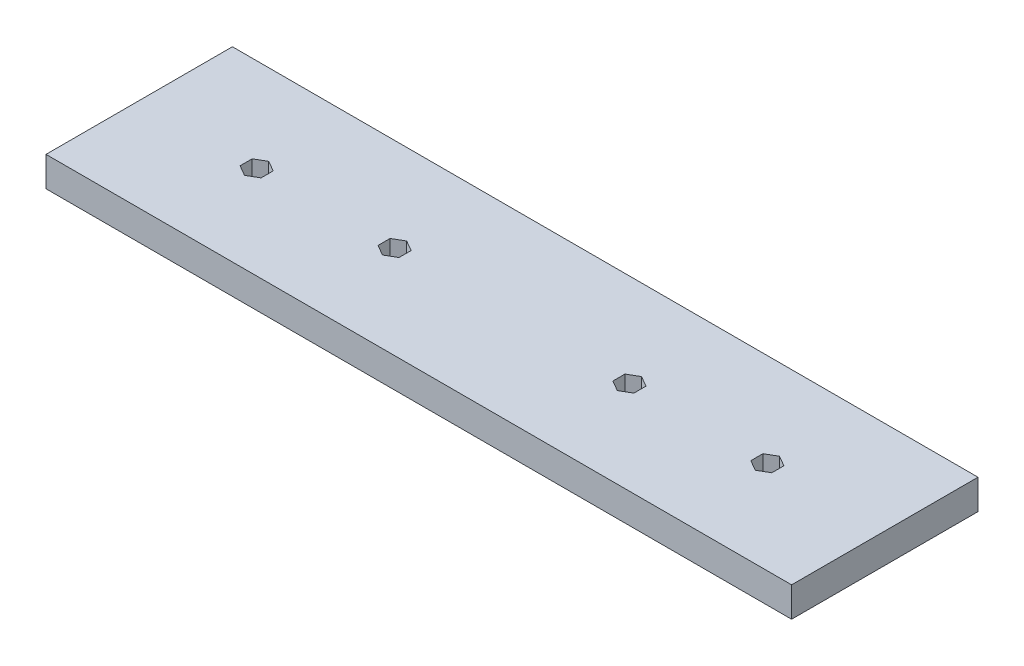
ISO-10303-21;
HEADER;
FILE_DESCRIPTION(('STEP AP214'),'2;1');
FILE_NAME('part.step','',(''),(''),'','','');
FILE_SCHEMA(('AUTOMOTIVE_DESIGN { 1 0 10303 214 1 1 1 1 }'));
ENDSEC;
DATA;
#1=APPLICATION_CONTEXT('core data for automotive mechanical design processes');
#2=APPLICATION_PROTOCOL_DEFINITION('international standard','automotive_design',2000,#1);
#3=PRODUCT_CONTEXT('',#1,'mechanical');
#4=PRODUCT('Part','Part','',(#3));
#5=PRODUCT_RELATED_PRODUCT_CATEGORY('part','',(#4));
#6=PRODUCT_DEFINITION_FORMATION('','',#4);
#7=PRODUCT_DEFINITION_CONTEXT('part definition',#1,'design');
#8=PRODUCT_DEFINITION('design','',#6,#7);
#9=PRODUCT_DEFINITION_SHAPE('','',#8);
#10=(LENGTH_UNIT() NAMED_UNIT(*) SI_UNIT(.MILLI.,.METRE.));
#11=(NAMED_UNIT(*) PLANE_ANGLE_UNIT() SI_UNIT($,.RADIAN.));
#12=(NAMED_UNIT(*) SI_UNIT($,.STERADIAN.) SOLID_ANGLE_UNIT());
#13=UNCERTAINTY_MEASURE_WITH_UNIT(LENGTH_MEASURE(1.E-05),#10,'distance_accuracy_value','');
#14=(GEOMETRIC_REPRESENTATION_CONTEXT(3) GLOBAL_UNCERTAINTY_ASSIGNED_CONTEXT((#13)) GLOBAL_UNIT_ASSIGNED_CONTEXT((#10,
#11,#12)) REPRESENTATION_CONTEXT('',''));
#15=CARTESIAN_POINT('',(0.,0.,0.));
#16=DIRECTION('',(0.,0.,1.));
#17=DIRECTION('',(1.,0.,0.));
#18=AXIS2_PLACEMENT_3D('',#15,#16,#17);
#19=CARTESIAN_POINT('',(375.,-0.00999999999999959,-50.));
#20=DIRECTION('',(-1.,0.,0.));
#21=DIRECTION('',(0.,0.,1.));
#22=AXIS2_PLACEMENT_3D('',#19,#20,#21);
#23=PLANE('',#22);
#24=DIRECTION('',(0.,0.,-1.));
#25=VECTOR('',#24,1.);
#26=CARTESIAN_POINT('',(375.,0.,0.));
#27=LINE('',#26,#25);
#28=CARTESIAN_POINT('',(375.,0.,0.));
#29=VERTEX_POINT('',#28);
#30=CARTESIAN_POINT('',(375.,0.,-50.));
#31=VERTEX_POINT('',#30);
#32=EDGE_CURVE('E213',#29,#31,#27,.T.);
#33=ORIENTED_EDGE('',*,*,#32,.T.);
#34=DIRECTION('',(0.,-1.,0.));
#35=VECTOR('',#34,1.);
#36=CARTESIAN_POINT('',(375.,8.,-50.));
#37=LINE('',#36,#35);
#38=CARTESIAN_POINT('',(375.,8.,-50.));
#39=VERTEX_POINT('',#38);
#40=EDGE_CURVE('E219',#39,#31,#37,.T.);
#41=ORIENTED_EDGE('',*,*,#40,.F.);
#42=DIRECTION('',(0.,0.,-1.));
#43=VECTOR('',#42,1.);
#44=CARTESIAN_POINT('',(375.,8.,0.));
#45=LINE('',#44,#43);
#46=CARTESIAN_POINT('',(375.,8.,0.));
#47=VERTEX_POINT('',#46);
#48=EDGE_CURVE('E223',#47,#39,#45,.T.);
#49=ORIENTED_EDGE('',*,*,#48,.F.);
#50=DIRECTION('',(0.,1.,0.));
#51=VECTOR('',#50,1.);
#52=CARTESIAN_POINT('',(375.,8.,0.));
#53=LINE('',#52,#51);
#54=EDGE_CURVE('E216',#29,#47,#53,.T.);
#55=ORIENTED_EDGE('',*,*,#54,.F.);
#56=EDGE_LOOP('',(#33,#41,#49,#55));
#57=FACE_BOUND('',#56,.T.);
#58=ADVANCED_FACE('F36',(#57),#23,.F.);
#59=CARTESIAN_POINT('',(175.,-0.00999999999999959,-50.));
#60=DIRECTION('',(-1.,0.,0.));
#61=DIRECTION('',(0.,0.,1.));
#62=AXIS2_PLACEMENT_3D('',#59,#60,#61);
#63=PLANE('',#62);
#64=DIRECTION('',(0.,0.,-1.));
#65=VECTOR('',#64,1.);
#66=CARTESIAN_POINT('',(175.,0.,0.));
#67=LINE('',#66,#65);
#68=CARTESIAN_POINT('',(175.,0.,0.));
#69=VERTEX_POINT('',#68);
#70=CARTESIAN_POINT('',(175.,0.,-50.));
#71=VERTEX_POINT('',#70);
#72=EDGE_CURVE('E226',#69,#71,#67,.T.);
#73=ORIENTED_EDGE('',*,*,#72,.F.);
#74=DIRECTION('',(0.,1.,0.));
#75=VECTOR('',#74,1.);
#76=CARTESIAN_POINT('',(175.,8.,0.));
#77=LINE('',#76,#75);
#78=CARTESIAN_POINT('',(175.,8.,0.));
#79=VERTEX_POINT('',#78);
#80=EDGE_CURVE('E220',#69,#79,#77,.T.);
#81=ORIENTED_EDGE('',*,*,#80,.T.);
#82=DIRECTION('',(0.,0.,-1.));
#83=VECTOR('',#82,1.);
#84=CARTESIAN_POINT('',(175.,8.,0.));
#85=LINE('',#84,#83);
#86=CARTESIAN_POINT('',(175.,8.,-50.));
#87=VERTEX_POINT('',#86);
#88=EDGE_CURVE('E40',#79,#87,#85,.T.);
#89=ORIENTED_EDGE('',*,*,#88,.T.);
#90=DIRECTION('',(0.,-1.,0.));
#91=VECTOR('',#90,1.);
#92=CARTESIAN_POINT('',(175.,8.,-50.));
#93=LINE('',#92,#91);
#94=EDGE_CURVE('E241',#87,#71,#93,.T.);
#95=ORIENTED_EDGE('',*,*,#94,.T.);
#96=EDGE_LOOP('',(#73,#81,#89,#95));
#97=FACE_BOUND('',#96,.T.);
#98=ADVANCED_FACE('F250',(#97),#63,.T.);
#99=CARTESIAN_POINT('',(0.,3.,0.));
#100=DIRECTION('',(0.,1.,0.));
#101=DIRECTION('',(0.,0.,1.));
#102=AXIS2_PLACEMENT_3D('',#99,#100,#101);
#103=PLANE('',#102);
#104=DIRECTION('',(0.86602540378444,0.,0.499999999999998));
#105=VECTOR('',#104,1.);
#106=CARTESIAN_POINT('',(203.685417437701,3.,-23.375));
#107=LINE('',#106,#105);
#108=CARTESIAN_POINT('',(203.685417437701,3.,-23.375));
#109=VERTEX_POINT('',#108);
#110=CARTESIAN_POINT('',(206.5,3.,-21.75));
#111=VERTEX_POINT('',#110);
#112=EDGE_CURVE('E188',#109,#111,#107,.T.);
#113=ORIENTED_EDGE('',*,*,#112,.T.);
#114=DIRECTION('',(0.866025403784439,0.,-0.499999999999999));
#115=VECTOR('',#114,1.);
#116=CARTESIAN_POINT('',(206.5,3.,-21.75));
#117=LINE('',#116,#115);
#118=CARTESIAN_POINT('',(209.314582562299,3.,-23.375));
#119=VERTEX_POINT('',#118);
#120=EDGE_CURVE('E197',#111,#119,#117,.T.);
#121=ORIENTED_EDGE('',*,*,#120,.T.);
#122=DIRECTION('',(0.,0.,-1.));
#123=VECTOR('',#122,1.);
#124=CARTESIAN_POINT('',(209.314582562299,3.,-23.375));
#125=LINE('',#124,#123);
#126=CARTESIAN_POINT('',(209.314582562299,3.,-26.625));
#127=VERTEX_POINT('',#126);
#128=EDGE_CURVE('E201',#119,#127,#125,.T.);
#129=ORIENTED_EDGE('',*,*,#128,.T.);
#130=DIRECTION('',(-0.86602540378444,0.,-0.499999999999998));
#131=VECTOR('',#130,1.);
#132=CARTESIAN_POINT('',(209.314582562299,3.,-26.625));
#133=LINE('',#132,#131);
#134=CARTESIAN_POINT('',(206.5,3.,-28.25));
#135=VERTEX_POINT('',#134);
#136=EDGE_CURVE('E456',#127,#135,#133,.T.);
#137=ORIENTED_EDGE('',*,*,#136,.T.);
#138=DIRECTION('',(-0.866025403784439,0.,0.499999999999999));
#139=VECTOR('',#138,1.);
#140=CARTESIAN_POINT('',(206.5,3.,-28.25));
#141=LINE('',#140,#139);
#142=CARTESIAN_POINT('',(203.685417437701,3.,-26.625));
#143=VERTEX_POINT('',#142);
#144=EDGE_CURVE('E454',#135,#143,#141,.T.);
#145=ORIENTED_EDGE('',*,*,#144,.T.);
#146=DIRECTION('',(0.,0.,1.));
#147=VECTOR('',#146,1.);
#148=CARTESIAN_POINT('',(203.685417437701,3.,-26.625));
#149=LINE('',#148,#147);
#150=EDGE_CURVE('E194',#143,#109,#149,.T.);
#151=ORIENTED_EDGE('',*,*,#150,.T.);
#152=EDGE_LOOP('',(#113,#121,#129,#137,#145,#151));
#153=FACE_BOUND('',#152,.T.);
#154=ADVANCED_FACE('F203',(#153),#103,.T.);
#155=CARTESIAN_POINT('',(0.,3.,0.));
#156=DIRECTION('',(0.,1.,0.));
#157=DIRECTION('',(0.,0.,1.));
#158=AXIS2_PLACEMENT_3D('',#155,#156,#157);
#159=PLANE('',#158);
#160=DIRECTION('',(-0.866025403784437,0.,-0.500000000000003));
#161=VECTOR('',#160,1.);
#162=CARTESIAN_POINT('',(246.314582562299,3.,-26.625));
#163=LINE('',#162,#161);
#164=CARTESIAN_POINT('',(246.314582562299,3.,-26.625));
#165=VERTEX_POINT('',#164);
#166=CARTESIAN_POINT('',(243.5,3.,-28.25));
#167=VERTEX_POINT('',#166);
#168=EDGE_CURVE('E405',#165,#167,#163,.T.);
#169=ORIENTED_EDGE('',*,*,#168,.T.);
#170=DIRECTION('',(-0.86602540378444,0.,0.499999999999998));
#171=VECTOR('',#170,1.);
#172=CARTESIAN_POINT('',(243.5,3.,-28.25));
#173=LINE('',#172,#171);
#174=CARTESIAN_POINT('',(240.685417437701,3.,-26.625));
#175=VERTEX_POINT('',#174);
#176=EDGE_CURVE('E429',#167,#175,#173,.T.);
#177=ORIENTED_EDGE('',*,*,#176,.T.);
#178=DIRECTION('',(0.,0.,1.));
#179=VECTOR('',#178,1.);
#180=CARTESIAN_POINT('',(240.685417437701,3.,-26.625));
#181=LINE('',#180,#179);
#182=CARTESIAN_POINT('',(240.685417437701,3.,-23.375));
#183=VERTEX_POINT('',#182);
#184=EDGE_CURVE('E426',#175,#183,#181,.T.);
#185=ORIENTED_EDGE('',*,*,#184,.T.);
#186=DIRECTION('',(0.86602540378444,0.,0.499999999999999));
#187=VECTOR('',#186,1.);
#188=CARTESIAN_POINT('',(240.685417437701,3.,-23.375));
#189=LINE('',#188,#187);
#190=CARTESIAN_POINT('',(243.5,3.,-21.75));
#191=VERTEX_POINT('',#190);
#192=EDGE_CURVE('E423',#183,#191,#189,.T.);
#193=ORIENTED_EDGE('',*,*,#192,.T.);
#194=DIRECTION('',(0.866025403784439,0.,-0.499999999999999));
#195=VECTOR('',#194,1.);
#196=CARTESIAN_POINT('',(243.5,3.,-21.75));
#197=LINE('',#196,#195);
#198=CARTESIAN_POINT('',(246.314582562299,3.,-23.375));
#199=VERTEX_POINT('',#198);
#200=EDGE_CURVE('E420',#191,#199,#197,.T.);
#201=ORIENTED_EDGE('',*,*,#200,.T.);
#202=DIRECTION('',(0.,0.,-1.));
#203=VECTOR('',#202,1.);
#204=CARTESIAN_POINT('',(246.314582562299,3.,-23.375));
#205=LINE('',#204,#203);
#206=EDGE_CURVE('E390',#199,#165,#205,.T.);
#207=ORIENTED_EDGE('',*,*,#206,.T.);
#208=EDGE_LOOP('',(#169,#177,#185,#193,#201,#207));
#209=FACE_BOUND('',#208,.T.);
#210=ADVANCED_FACE('F567',(#209),#159,.T.);
#211=CARTESIAN_POINT('',(0.,3.,0.));
#212=DIRECTION('',(0.,1.,0.));
#213=DIRECTION('',(0.,0.,1.));
#214=AXIS2_PLACEMENT_3D('',#211,#212,#213);
#215=PLANE('',#214);
#216=DIRECTION('',(0.86602540378444,0.,0.499999999999998));
#217=VECTOR('',#216,1.);
#218=CARTESIAN_POINT('',(303.685417437701,3.,-23.375));
#219=LINE('',#218,#217);
#220=CARTESIAN_POINT('',(303.685417437701,3.,-23.375));
#221=VERTEX_POINT('',#220);
#222=CARTESIAN_POINT('',(306.5,3.,-21.75));
#223=VERTEX_POINT('',#222);
#224=EDGE_CURVE('E356',#221,#223,#219,.T.);
#225=ORIENTED_EDGE('',*,*,#224,.T.);
#226=DIRECTION('',(0.866025403784439,0.,-0.499999999999999));
#227=VECTOR('',#226,1.);
#228=CARTESIAN_POINT('',(306.5,3.,-21.75));
#229=LINE('',#228,#227);
#230=CARTESIAN_POINT('',(309.3145825623,3.,-23.375));
#231=VERTEX_POINT('',#230);
#232=EDGE_CURVE('E382',#223,#231,#229,.T.);
#233=ORIENTED_EDGE('',*,*,#232,.T.);
#234=DIRECTION('',(0.,0.,-1.));
#235=VECTOR('',#234,1.);
#236=CARTESIAN_POINT('',(309.3145825623,3.,-23.375));
#237=LINE('',#236,#235);
#238=CARTESIAN_POINT('',(309.3145825623,3.,-26.625));
#239=VERTEX_POINT('',#238);
#240=EDGE_CURVE('E379',#231,#239,#237,.T.);
#241=ORIENTED_EDGE('',*,*,#240,.T.);
#242=DIRECTION('',(-0.86602540378444,0.,-0.499999999999998));
#243=VECTOR('',#242,1.);
#244=CARTESIAN_POINT('',(309.3145825623,3.,-26.625));
#245=LINE('',#244,#243);
#246=CARTESIAN_POINT('',(306.5,3.,-28.25));
#247=VERTEX_POINT('',#246);
#248=EDGE_CURVE('E376',#239,#247,#245,.T.);
#249=ORIENTED_EDGE('',*,*,#248,.T.);
#250=DIRECTION('',(-0.866025403784439,0.,0.499999999999999));
#251=VECTOR('',#250,1.);
#252=CARTESIAN_POINT('',(306.5,3.,-28.25));
#253=LINE('',#252,#251);
#254=CARTESIAN_POINT('',(303.685417437701,3.,-26.625));
#255=VERTEX_POINT('',#254);
#256=EDGE_CURVE('E373',#247,#255,#253,.T.);
#257=ORIENTED_EDGE('',*,*,#256,.T.);
#258=DIRECTION('',(0.,0.,1.));
#259=VECTOR('',#258,1.);
#260=CARTESIAN_POINT('',(303.685417437701,3.,-26.625));
#261=LINE('',#260,#259);
#262=EDGE_CURVE('E340',#255,#221,#261,.T.);
#263=ORIENTED_EDGE('',*,*,#262,.T.);
#264=EDGE_LOOP('',(#225,#233,#241,#249,#257,#263));
#265=FACE_BOUND('',#264,.T.);
#266=ADVANCED_FACE('F544',(#265),#215,.T.);
#267=CARTESIAN_POINT('',(0.,3.,0.));
#268=DIRECTION('',(0.,1.,0.));
#269=DIRECTION('',(0.,0.,1.));
#270=AXIS2_PLACEMENT_3D('',#267,#268,#269);
#271=PLANE('',#270);
#272=DIRECTION('',(-0.866025403784433,0.,-0.50000000000001));
#273=VECTOR('',#272,1.);
#274=CARTESIAN_POINT('',(346.314582562299,3.,-26.625));
#275=LINE('',#274,#273);
#276=CARTESIAN_POINT('',(346.314582562299,3.,-26.625));
#277=VERTEX_POINT('',#276);
#278=CARTESIAN_POINT('',(343.5,3.,-28.25));
#279=VERTEX_POINT('',#278);
#280=EDGE_CURVE('E316',#277,#279,#275,.T.);
#281=ORIENTED_EDGE('',*,*,#280,.T.);
#282=DIRECTION('',(-0.86602540378444,0.,0.499999999999998));
#283=VECTOR('',#282,1.);
#284=CARTESIAN_POINT('',(343.5,3.,-28.25));
#285=LINE('',#284,#283);
#286=CARTESIAN_POINT('',(340.685417437701,3.,-26.625));
#287=VERTEX_POINT('',#286);
#288=EDGE_CURVE('E332',#279,#287,#285,.T.);
#289=ORIENTED_EDGE('',*,*,#288,.T.);
#290=DIRECTION('',(0.,0.,1.));
#291=VECTOR('',#290,1.);
#292=CARTESIAN_POINT('',(340.685417437701,3.,-26.625));
#293=LINE('',#292,#291);
#294=CARTESIAN_POINT('',(340.685417437701,3.,-23.375));
#295=VERTEX_POINT('',#294);
#296=EDGE_CURVE('E329',#287,#295,#293,.T.);
#297=ORIENTED_EDGE('',*,*,#296,.T.);
#298=DIRECTION('',(0.866025403784435,0.,0.500000000000006));
#299=VECTOR('',#298,1.);
#300=CARTESIAN_POINT('',(340.685417437701,3.,-23.375));
#301=LINE('',#300,#299);
#302=CARTESIAN_POINT('',(343.5,3.,-21.75));
#303=VERTEX_POINT('',#302);
#304=EDGE_CURVE('E327',#295,#303,#301,.T.);
#305=ORIENTED_EDGE('',*,*,#304,.T.);
#306=DIRECTION('',(0.866025403784441,0.,-0.499999999999995));
#307=VECTOR('',#306,1.);
#308=CARTESIAN_POINT('',(343.5,3.,-21.75));
#309=LINE('',#308,#307);
#310=CARTESIAN_POINT('',(346.314582562299,3.,-23.375));
#311=VERTEX_POINT('',#310);
#312=EDGE_CURVE('E296',#303,#311,#309,.T.);
#313=ORIENTED_EDGE('',*,*,#312,.T.);
#314=DIRECTION('',(0.,0.,-1.));
#315=VECTOR('',#314,1.);
#316=CARTESIAN_POINT('',(346.314582562299,3.,-23.375));
#317=LINE('',#316,#315);
#318=EDGE_CURVE('E322',#311,#277,#317,.T.);
#319=ORIENTED_EDGE('',*,*,#318,.T.);
#320=EDGE_LOOP('',(#281,#289,#297,#305,#313,#319));
#321=FACE_BOUND('',#320,.T.);
#322=ADVANCED_FACE('F496',(#321),#271,.T.);
#323=CARTESIAN_POINT('',(0.,8.,-50.));
#324=DIRECTION('',(0.,0.,1.));
#325=DIRECTION('',(1.,0.,0.));
#326=AXIS2_PLACEMENT_3D('',#323,#324,#325);
#327=PLANE('',#326);
#328=ORIENTED_EDGE('',*,*,#94,.F.);
#329=DIRECTION('',(-1.,0.,0.));
#330=VECTOR('',#329,1.);
#331=CARTESIAN_POINT('',(0.,8.,-50.));
#332=LINE('',#331,#330);
#333=EDGE_CURVE('E237',#39,#87,#332,.T.);
#334=ORIENTED_EDGE('',*,*,#333,.F.);
#335=ORIENTED_EDGE('',*,*,#40,.T.);
#336=DIRECTION('',(-1.,0.,0.));
#337=VECTOR('',#336,1.);
#338=CARTESIAN_POINT('',(0.,0.,-50.));
#339=LINE('',#338,#337);
#340=EDGE_CURVE('E231',#31,#71,#339,.T.);
#341=ORIENTED_EDGE('',*,*,#340,.T.);
#342=EDGE_LOOP('',(#328,#334,#335,#341));
#343=FACE_BOUND('',#342,.T.);
#344=ADVANCED_FACE('F492',(#343),#327,.F.);
#345=CARTESIAN_POINT('',(0.,8.,0.));
#346=DIRECTION('',(0.,0.,-1.));
#347=DIRECTION('',(-1.,0.,0.));
#348=AXIS2_PLACEMENT_3D('',#345,#346,#347);
#349=PLANE('',#348);
#350=ORIENTED_EDGE('',*,*,#80,.F.);
#351=DIRECTION('',(1.,0.,0.));
#352=VECTOR('',#351,1.);
#353=CARTESIAN_POINT('',(0.,0.,0.));
#354=LINE('',#353,#352);
#355=EDGE_CURVE('E227',#69,#29,#354,.T.);
#356=ORIENTED_EDGE('',*,*,#355,.T.);
#357=ORIENTED_EDGE('',*,*,#54,.T.);
#358=DIRECTION('',(1.,0.,0.));
#359=VECTOR('',#358,1.);
#360=CARTESIAN_POINT('',(0.,8.,0.));
#361=LINE('',#360,#359);
#362=EDGE_CURVE('E234',#79,#47,#361,.T.);
#363=ORIENTED_EDGE('',*,*,#362,.F.);
#364=EDGE_LOOP('',(#350,#356,#357,#363));
#365=FACE_BOUND('',#364,.T.);
#366=ADVANCED_FACE('F495',(#365),#349,.F.);
#367=CARTESIAN_POINT('',(0.,0.,0.));
#368=DIRECTION('',(0.,-1.,0.));
#369=DIRECTION('',(0.,0.,-1.));
#370=AXIS2_PLACEMENT_3D('',#367,#368,#369);
#371=PLANE('',#370);
#372=ORIENTED_EDGE('',*,*,#355,.F.);
#373=ORIENTED_EDGE('',*,*,#72,.T.);
#374=ORIENTED_EDGE('',*,*,#340,.F.);
#375=ORIENTED_EDGE('',*,*,#32,.F.);
#376=EDGE_LOOP('',(#372,#373,#374,#375));
#377=FACE_BOUND('',#376,.T.);
#378=ADVANCED_FACE('F499',(#377),#371,.T.);
#379=CARTESIAN_POINT('',(209.314582562299,3.,-23.375));
#380=DIRECTION('',(1.,0.,0.));
#381=DIRECTION('',(0.,0.,-1.));
#382=AXIS2_PLACEMENT_3D('',#379,#380,#381);
#383=PLANE('',#382);
#384=DIRECTION('',(0.,0.,-1.));
#385=VECTOR('',#384,1.);
#386=CARTESIAN_POINT('',(209.314582562299,8.,-23.375));
#387=LINE('',#386,#385);
#388=CARTESIAN_POINT('',(209.314582562299,8.,-23.375));
#389=VERTEX_POINT('',#388);
#390=CARTESIAN_POINT('',(209.314582562299,8.,-26.625));
#391=VERTEX_POINT('',#390);
#392=EDGE_CURVE('E447',#389,#391,#387,.T.);
#393=ORIENTED_EDGE('',*,*,#392,.T.);
#394=DIRECTION('',(0.,1.,0.));
#395=VECTOR('',#394,1.);
#396=CARTESIAN_POINT('',(209.314582562299,3.,-26.625));
#397=LINE('',#396,#395);
#398=EDGE_CURVE('E435',#127,#391,#397,.T.);
#399=ORIENTED_EDGE('',*,*,#398,.F.);
#400=ORIENTED_EDGE('',*,*,#128,.F.);
#401=DIRECTION('',(0.,1.,0.));
#402=VECTOR('',#401,1.);
#403=CARTESIAN_POINT('',(209.314582562299,3.,-23.375));
#404=LINE('',#403,#402);
#405=EDGE_CURVE('E178',#119,#389,#404,.T.);
#406=ORIENTED_EDGE('',*,*,#405,.T.);
#407=EDGE_LOOP('',(#393,#399,#400,#406));
#408=FACE_BOUND('',#407,.T.);
#409=ADVANCED_FACE('F460',(#408),#383,.F.);
#410=CARTESIAN_POINT('',(209.314582562299,3.,-26.625));
#411=DIRECTION('',(0.499999999999998,0.,-0.86602540378444));
#412=DIRECTION('',(-0.86602540378444,0.,-0.499999999999998));
#413=AXIS2_PLACEMENT_3D('',#410,#411,#412);
#414=PLANE('',#413);
#415=DIRECTION('',(-0.86602540378444,0.,-0.499999999999998));
#416=VECTOR('',#415,1.);
#417=CARTESIAN_POINT('',(209.314582562299,8.,-26.625));
#418=LINE('',#417,#416);
#419=CARTESIAN_POINT('',(206.5,8.,-28.25));
#420=VERTEX_POINT('',#419);
#421=EDGE_CURVE('E444',#391,#420,#418,.T.);
#422=ORIENTED_EDGE('',*,*,#421,.T.);
#423=DIRECTION('',(0.,1.,0.));
#424=VECTOR('',#423,1.);
#425=CARTESIAN_POINT('',(206.5,3.,-28.25));
#426=LINE('',#425,#424);
#427=EDGE_CURVE('E437',#135,#420,#426,.T.);
#428=ORIENTED_EDGE('',*,*,#427,.F.);
#429=ORIENTED_EDGE('',*,*,#136,.F.);
#430=ORIENTED_EDGE('',*,*,#398,.T.);
#431=EDGE_LOOP('',(#422,#428,#429,#430));
#432=FACE_BOUND('',#431,.T.);
#433=ADVANCED_FACE('F464',(#432),#414,.F.);
#434=CARTESIAN_POINT('',(206.5,3.,-28.25));
#435=DIRECTION('',(-0.499999999999999,0.,-0.866025403784439));
#436=DIRECTION('',(-0.866025403784439,0.,0.499999999999999));
#437=AXIS2_PLACEMENT_3D('',#434,#435,#436);
#438=PLANE('',#437);
#439=DIRECTION('',(-0.866025403784439,0.,0.499999999999999));
#440=VECTOR('',#439,1.);
#441=CARTESIAN_POINT('',(206.5,8.,-28.25));
#442=LINE('',#441,#440);
#443=CARTESIAN_POINT('',(203.685417437701,8.,-26.625));
#444=VERTEX_POINT('',#443);
#445=EDGE_CURVE('E209',#420,#444,#442,.T.);
#446=ORIENTED_EDGE('',*,*,#445,.T.);
#447=DIRECTION('',(0.,1.,0.));
#448=VECTOR('',#447,1.);
#449=CARTESIAN_POINT('',(203.685417437701,3.,-26.625));
#450=LINE('',#449,#448);
#451=EDGE_CURVE('E439',#143,#444,#450,.T.);
#452=ORIENTED_EDGE('',*,*,#451,.F.);
#453=ORIENTED_EDGE('',*,*,#144,.F.);
#454=ORIENTED_EDGE('',*,*,#427,.T.);
#455=EDGE_LOOP('',(#446,#452,#453,#454));
#456=FACE_BOUND('',#455,.T.);
#457=ADVANCED_FACE('F468',(#456),#438,.F.);
#458=CARTESIAN_POINT('',(203.685417437701,3.,-26.625));
#459=DIRECTION('',(-1.,0.,0.));
#460=DIRECTION('',(0.,0.,1.));
#461=AXIS2_PLACEMENT_3D('',#458,#459,#460);
#462=PLANE('',#461);
#463=DIRECTION('',(0.,0.,1.));
#464=VECTOR('',#463,1.);
#465=CARTESIAN_POINT('',(203.685417437701,8.,-26.625));
#466=LINE('',#465,#464);
#467=CARTESIAN_POINT('',(203.685417437701,8.,-23.375));
#468=VERTEX_POINT('',#467);
#469=EDGE_CURVE('E206',#444,#468,#466,.T.);
#470=ORIENTED_EDGE('',*,*,#469,.T.);
#471=DIRECTION('',(0.,1.,0.));
#472=VECTOR('',#471,1.);
#473=CARTESIAN_POINT('',(203.685417437701,3.,-23.375));
#474=LINE('',#473,#472);
#475=EDGE_CURVE('E230',#109,#468,#474,.T.);
#476=ORIENTED_EDGE('',*,*,#475,.F.);
#477=ORIENTED_EDGE('',*,*,#150,.F.);
#478=ORIENTED_EDGE('',*,*,#451,.T.);
#479=EDGE_LOOP('',(#470,#476,#477,#478));
#480=FACE_BOUND('',#479,.T.);
#481=ADVANCED_FACE('F470',(#480),#462,.F.);
#482=CARTESIAN_POINT('',(203.685417437701,3.,-23.375));
#483=DIRECTION('',(-0.499999999999998,0.,0.86602540378444));
#484=DIRECTION('',(0.86602540378444,0.,0.499999999999998));
#485=AXIS2_PLACEMENT_3D('',#482,#483,#484);
#486=PLANE('',#485);
#487=DIRECTION('',(0.86602540378444,0.,0.499999999999998));
#488=VECTOR('',#487,1.);
#489=CARTESIAN_POINT('',(203.685417437701,8.,-23.375));
#490=LINE('',#489,#488);
#491=CARTESIAN_POINT('',(206.5,8.,-21.75));
#492=VERTEX_POINT('',#491);
#493=EDGE_CURVE('E192',#468,#492,#490,.T.);
#494=ORIENTED_EDGE('',*,*,#493,.T.);
#495=DIRECTION('',(0.,1.,0.));
#496=VECTOR('',#495,1.);
#497=CARTESIAN_POINT('',(206.5,3.,-21.75));
#498=LINE('',#497,#496);
#499=EDGE_CURVE('E185',#111,#492,#498,.T.);
#500=ORIENTED_EDGE('',*,*,#499,.F.);
#501=ORIENTED_EDGE('',*,*,#112,.F.);
#502=ORIENTED_EDGE('',*,*,#475,.T.);
#503=EDGE_LOOP('',(#494,#500,#501,#502));
#504=FACE_BOUND('',#503,.T.);
#505=ADVANCED_FACE('F186',(#504),#486,.F.);
#506=CARTESIAN_POINT('',(206.5,3.,-21.75));
#507=DIRECTION('',(0.499999999999999,0.,0.866025403784439));
#508=DIRECTION('',(0.866025403784439,0.,-0.499999999999999));
#509=AXIS2_PLACEMENT_3D('',#506,#507,#508);
#510=PLANE('',#509);
#511=DIRECTION('',(0.866025403784439,0.,-0.499999999999999));
#512=VECTOR('',#511,1.);
#513=CARTESIAN_POINT('',(206.5,8.,-21.75));
#514=LINE('',#513,#512);
#515=EDGE_CURVE('E450',#492,#389,#514,.T.);
#516=ORIENTED_EDGE('',*,*,#515,.T.);
#517=ORIENTED_EDGE('',*,*,#405,.F.);
#518=ORIENTED_EDGE('',*,*,#120,.F.);
#519=ORIENTED_EDGE('',*,*,#499,.T.);
#520=EDGE_LOOP('',(#516,#517,#518,#519));
#521=FACE_BOUND('',#520,.T.);
#522=ADVANCED_FACE('F198',(#521),#510,.F.);
#523=CARTESIAN_POINT('',(240.685417437701,3.,-26.625));
#524=DIRECTION('',(-1.,0.,0.));
#525=DIRECTION('',(0.,0.,1.));
#526=AXIS2_PLACEMENT_3D('',#523,#524,#525);
#527=PLANE('',#526);
#528=DIRECTION('',(0.,0.,1.));
#529=VECTOR('',#528,1.);
#530=CARTESIAN_POINT('',(240.685417437701,8.,-26.625));
#531=LINE('',#530,#529);
#532=CARTESIAN_POINT('',(240.685417437701,8.,-26.625));
#533=VERTEX_POINT('',#532);
#534=CARTESIAN_POINT('',(240.685417437701,8.,-23.375));
#535=VERTEX_POINT('',#534);
#536=EDGE_CURVE('E411',#533,#535,#531,.T.);
#537=ORIENTED_EDGE('',*,*,#536,.T.);
#538=DIRECTION('',(0.,1.,0.));
#539=VECTOR('',#538,1.);
#540=CARTESIAN_POINT('',(240.685417437701,3.,-23.375));
#541=LINE('',#540,#539);
#542=EDGE_CURVE('E393',#183,#535,#541,.T.);
#543=ORIENTED_EDGE('',*,*,#542,.F.);
#544=ORIENTED_EDGE('',*,*,#184,.F.);
#545=DIRECTION('',(0.,1.,0.));
#546=VECTOR('',#545,1.);
#547=CARTESIAN_POINT('',(240.685417437701,3.,-26.625));
#548=LINE('',#547,#546);
#549=EDGE_CURVE('E391',#175,#533,#548,.T.);
#550=ORIENTED_EDGE('',*,*,#549,.T.);
#551=EDGE_LOOP('',(#537,#543,#544,#550));
#552=FACE_BOUND('',#551,.T.);
#553=ADVANCED_FACE('F577',(#552),#527,.F.);
#554=CARTESIAN_POINT('',(240.685417437701,3.,-23.375));
#555=DIRECTION('',(-0.499999999999998,0.,0.86602540378444));
#556=DIRECTION('',(0.86602540378444,0.,0.499999999999998));
#557=AXIS2_PLACEMENT_3D('',#554,#555,#556);
#558=PLANE('',#557);
#559=DIRECTION('',(0.86602540378444,0.,0.499999999999999));
#560=VECTOR('',#559,1.);
#561=CARTESIAN_POINT('',(240.685417437701,8.,-23.375));
#562=LINE('',#561,#560);
#563=CARTESIAN_POINT('',(243.5,8.,-21.75));
#564=VERTEX_POINT('',#563);
#565=EDGE_CURVE('E408',#535,#564,#562,.T.);
#566=ORIENTED_EDGE('',*,*,#565,.T.);
#567=DIRECTION('',(0.,1.,0.));
#568=VECTOR('',#567,1.);
#569=CARTESIAN_POINT('',(243.5,3.,-21.75));
#570=LINE('',#569,#568);
#571=EDGE_CURVE('E395',#191,#564,#570,.T.);
#572=ORIENTED_EDGE('',*,*,#571,.F.);
#573=ORIENTED_EDGE('',*,*,#192,.F.);
#574=ORIENTED_EDGE('',*,*,#542,.T.);
#575=EDGE_LOOP('',(#566,#572,#573,#574));
#576=FACE_BOUND('',#575,.T.);
#577=ADVANCED_FACE('F580',(#576),#558,.F.);
#578=CARTESIAN_POINT('',(243.5,3.,-21.75));
#579=DIRECTION('',(0.499999999999999,0.,0.866025403784439));
#580=DIRECTION('',(0.866025403784439,0.,-0.499999999999999));
#581=AXIS2_PLACEMENT_3D('',#578,#579,#580);
#582=PLANE('',#581);
#583=DIRECTION('',(0.866025403784439,0.,-0.499999999999999));
#584=VECTOR('',#583,1.);
#585=CARTESIAN_POINT('',(243.5,8.,-21.75));
#586=LINE('',#585,#584);
#587=CARTESIAN_POINT('',(246.314582562299,8.,-23.375));
#588=VERTEX_POINT('',#587);
#589=EDGE_CURVE('E404',#564,#588,#586,.T.);
#590=ORIENTED_EDGE('',*,*,#589,.T.);
#591=DIRECTION('',(0.,1.,0.));
#592=VECTOR('',#591,1.);
#593=CARTESIAN_POINT('',(246.314582562299,3.,-23.375));
#594=LINE('',#593,#592);
#595=EDGE_CURVE('E397',#199,#588,#594,.T.);
#596=ORIENTED_EDGE('',*,*,#595,.F.);
#597=ORIENTED_EDGE('',*,*,#200,.F.);
#598=ORIENTED_EDGE('',*,*,#571,.T.);
#599=EDGE_LOOP('',(#590,#596,#597,#598));
#600=FACE_BOUND('',#599,.T.);
#601=ADVANCED_FACE('F584',(#600),#582,.F.);
#602=CARTESIAN_POINT('',(246.314582562299,3.,-23.375));
#603=DIRECTION('',(1.,0.,0.));
#604=DIRECTION('',(0.,0.,-1.));
#605=AXIS2_PLACEMENT_3D('',#602,#603,#604);
#606=PLANE('',#605);
#607=DIRECTION('',(0.,0.,-1.));
#608=VECTOR('',#607,1.);
#609=CARTESIAN_POINT('',(246.314582562299,8.,-23.375));
#610=LINE('',#609,#608);
#611=CARTESIAN_POINT('',(246.314582562299,8.,-26.625));
#612=VERTEX_POINT('',#611);
#613=EDGE_CURVE('E401',#588,#612,#610,.T.);
#614=ORIENTED_EDGE('',*,*,#613,.T.);
#615=DIRECTION('',(0.,1.,0.));
#616=VECTOR('',#615,1.);
#617=CARTESIAN_POINT('',(246.314582562299,3.,-26.625));
#618=LINE('',#617,#616);
#619=EDGE_CURVE('E399',#165,#612,#618,.T.);
#620=ORIENTED_EDGE('',*,*,#619,.F.);
#621=ORIENTED_EDGE('',*,*,#206,.F.);
#622=ORIENTED_EDGE('',*,*,#595,.T.);
#623=EDGE_LOOP('',(#614,#620,#621,#622));
#624=FACE_BOUND('',#623,.T.);
#625=ADVANCED_FACE('F572',(#624),#606,.F.);
#626=CARTESIAN_POINT('',(246.314582562299,3.,-26.625));
#627=DIRECTION('',(0.500000000000003,0.,-0.866025403784437));
#628=DIRECTION('',(-0.866025403784437,0.,-0.500000000000003));
#629=AXIS2_PLACEMENT_3D('',#626,#627,#628);
#630=PLANE('',#629);
#631=DIRECTION('',(-0.866025403784437,0.,-0.500000000000003));
#632=VECTOR('',#631,1.);
#633=CARTESIAN_POINT('',(246.314582562299,8.,-26.625));
#634=LINE('',#633,#632);
#635=CARTESIAN_POINT('',(243.5,8.,-28.25));
#636=VERTEX_POINT('',#635);
#637=EDGE_CURVE('E351',#612,#636,#634,.T.);
#638=ORIENTED_EDGE('',*,*,#637,.T.);
#639=DIRECTION('',(0.,1.,0.));
#640=VECTOR('',#639,1.);
#641=CARTESIAN_POINT('',(243.5,3.,-28.25));
#642=LINE('',#641,#640);
#643=EDGE_CURVE('E387',#167,#636,#642,.T.);
#644=ORIENTED_EDGE('',*,*,#643,.F.);
#645=ORIENTED_EDGE('',*,*,#168,.F.);
#646=ORIENTED_EDGE('',*,*,#619,.T.);
#647=EDGE_LOOP('',(#638,#644,#645,#646));
#648=FACE_BOUND('',#647,.T.);
#649=ADVANCED_FACE('F569',(#648),#630,.F.);
#650=CARTESIAN_POINT('',(243.5,3.,-28.25));
#651=DIRECTION('',(-0.499999999999998,0.,-0.86602540378444));
#652=DIRECTION('',(-0.86602540378444,0.,0.499999999999998));
#653=AXIS2_PLACEMENT_3D('',#650,#651,#652);
#654=PLANE('',#653);
#655=DIRECTION('',(-0.86602540378444,0.,0.499999999999998));
#656=VECTOR('',#655,1.);
#657=CARTESIAN_POINT('',(243.5,8.,-28.25));
#658=LINE('',#657,#656);
#659=EDGE_CURVE('E414',#636,#533,#658,.T.);
#660=ORIENTED_EDGE('',*,*,#659,.T.);
#661=ORIENTED_EDGE('',*,*,#549,.F.);
#662=ORIENTED_EDGE('',*,*,#176,.F.);
#663=ORIENTED_EDGE('',*,*,#643,.T.);
#664=EDGE_LOOP('',(#660,#661,#662,#663));
#665=FACE_BOUND('',#664,.T.);
#666=ADVANCED_FACE('F553',(#665),#654,.F.);
#667=CARTESIAN_POINT('',(309.3145825623,3.,-23.375));
#668=DIRECTION('',(1.,0.,0.));
#669=DIRECTION('',(0.,0.,-1.));
#670=AXIS2_PLACEMENT_3D('',#667,#668,#669);
#671=PLANE('',#670);
#672=DIRECTION('',(0.,0.,-1.));
#673=VECTOR('',#672,1.);
#674=CARTESIAN_POINT('',(309.3145825623,8.,-23.375));
#675=LINE('',#674,#673);
#676=CARTESIAN_POINT('',(309.3145825623,8.,-23.375));
#677=VERTEX_POINT('',#676);
#678=CARTESIAN_POINT('',(309.3145825623,8.,-26.625));
#679=VERTEX_POINT('',#678);
#680=EDGE_CURVE('E362',#677,#679,#675,.T.);
#681=ORIENTED_EDGE('',*,*,#680,.T.);
#682=DIRECTION('',(0.,1.,0.));
#683=VECTOR('',#682,1.);
#684=CARTESIAN_POINT('',(309.3145825623,3.,-26.625));
#685=LINE('',#684,#683);
#686=EDGE_CURVE('E343',#239,#679,#685,.T.);
#687=ORIENTED_EDGE('',*,*,#686,.F.);
#688=ORIENTED_EDGE('',*,*,#240,.F.);
#689=DIRECTION('',(0.,1.,0.));
#690=VECTOR('',#689,1.);
#691=CARTESIAN_POINT('',(309.3145825623,3.,-23.375));
#692=LINE('',#691,#690);
#693=EDGE_CURVE('E341',#231,#677,#692,.T.);
#694=ORIENTED_EDGE('',*,*,#693,.T.);
#695=EDGE_LOOP('',(#681,#687,#688,#694));
#696=FACE_BOUND('',#695,.T.);
#697=ADVANCED_FACE('F549',(#696),#671,.F.);
#698=CARTESIAN_POINT('',(309.3145825623,3.,-26.625));
#699=DIRECTION('',(0.499999999999998,0.,-0.86602540378444));
#700=DIRECTION('',(-0.86602540378444,0.,-0.499999999999998));
#701=AXIS2_PLACEMENT_3D('',#698,#699,#700);
#702=PLANE('',#701);
#703=DIRECTION('',(-0.86602540378444,0.,-0.499999999999998));
#704=VECTOR('',#703,1.);
#705=CARTESIAN_POINT('',(309.3145825623,8.,-26.625));
#706=LINE('',#705,#704);
#707=CARTESIAN_POINT('',(306.5,8.,-28.25));
#708=VERTEX_POINT('',#707);
#709=EDGE_CURVE('E359',#679,#708,#706,.T.);
#710=ORIENTED_EDGE('',*,*,#709,.T.);
#711=DIRECTION('',(0.,1.,0.));
#712=VECTOR('',#711,1.);
#713=CARTESIAN_POINT('',(306.5,3.,-28.25));
#714=LINE('',#713,#712);
#715=EDGE_CURVE('E345',#247,#708,#714,.T.);
#716=ORIENTED_EDGE('',*,*,#715,.F.);
#717=ORIENTED_EDGE('',*,*,#248,.F.);
#718=ORIENTED_EDGE('',*,*,#686,.T.);
#719=EDGE_LOOP('',(#710,#716,#717,#718));
#720=FACE_BOUND('',#719,.T.);
#721=ADVANCED_FACE('F552',(#720),#702,.F.);
#722=CARTESIAN_POINT('',(306.5,3.,-28.25));
#723=DIRECTION('',(-0.499999999999999,0.,-0.866025403784439));
#724=DIRECTION('',(-0.866025403784439,0.,0.499999999999999));
#725=AXIS2_PLACEMENT_3D('',#722,#723,#724);
#726=PLANE('',#725);
#727=DIRECTION('',(-0.866025403784439,0.,0.499999999999999));
#728=VECTOR('',#727,1.);
#729=CARTESIAN_POINT('',(306.5,8.,-28.25));
#730=LINE('',#729,#728);
#731=CARTESIAN_POINT('',(303.685417437701,8.,-26.625));
#732=VERTEX_POINT('',#731);
#733=EDGE_CURVE('E355',#708,#732,#730,.T.);
#734=ORIENTED_EDGE('',*,*,#733,.T.);
#735=DIRECTION('',(0.,1.,0.));
#736=VECTOR('',#735,1.);
#737=CARTESIAN_POINT('',(303.685417437701,3.,-26.625));
#738=LINE('',#737,#736);
#739=EDGE_CURVE('E347',#255,#732,#738,.T.);
#740=ORIENTED_EDGE('',*,*,#739,.F.);
#741=ORIENTED_EDGE('',*,*,#256,.F.);
#742=ORIENTED_EDGE('',*,*,#715,.T.);
#743=EDGE_LOOP('',(#734,#740,#741,#742));
#744=FACE_BOUND('',#743,.T.);
#745=ADVANCED_FACE('F557',(#744),#726,.F.);
#746=CARTESIAN_POINT('',(303.685417437701,3.,-26.625));
#747=DIRECTION('',(-1.,0.,0.));
#748=DIRECTION('',(0.,0.,1.));
#749=AXIS2_PLACEMENT_3D('',#746,#747,#748);
#750=PLANE('',#749);
#751=DIRECTION('',(0.,0.,1.));
#752=VECTOR('',#751,1.);
#753=CARTESIAN_POINT('',(303.685417437701,8.,-26.625));
#754=LINE('',#753,#752);
#755=CARTESIAN_POINT('',(303.685417437701,8.,-23.375));
#756=VERTEX_POINT('',#755);
#757=EDGE_CURVE('E352',#732,#756,#754,.T.);
#758=ORIENTED_EDGE('',*,*,#757,.T.);
#759=DIRECTION('',(0.,1.,0.));
#760=VECTOR('',#759,1.);
#761=CARTESIAN_POINT('',(303.685417437701,3.,-23.375));
#762=LINE('',#761,#760);
#763=EDGE_CURVE('E349',#221,#756,#762,.T.);
#764=ORIENTED_EDGE('',*,*,#763,.F.);
#765=ORIENTED_EDGE('',*,*,#262,.F.);
#766=ORIENTED_EDGE('',*,*,#739,.T.);
#767=EDGE_LOOP('',(#758,#764,#765,#766));
#768=FACE_BOUND('',#767,.T.);
#769=ADVANCED_FACE('F546',(#768),#750,.F.);
#770=CARTESIAN_POINT('',(303.685417437701,3.,-23.375));
#771=DIRECTION('',(-0.499999999999998,0.,0.86602540378444));
#772=DIRECTION('',(0.86602540378444,0.,0.499999999999998));
#773=AXIS2_PLACEMENT_3D('',#770,#771,#772);
#774=PLANE('',#773);
#775=DIRECTION('',(0.86602540378444,0.,0.499999999999998));
#776=VECTOR('',#775,1.);
#777=CARTESIAN_POINT('',(303.685417437701,8.,-23.375));
#778=LINE('',#777,#776);
#779=CARTESIAN_POINT('',(306.5,8.,-21.75));
#780=VERTEX_POINT('',#779);
#781=EDGE_CURVE('E368',#756,#780,#778,.T.);
#782=ORIENTED_EDGE('',*,*,#781,.T.);
#783=DIRECTION('',(0.,1.,0.));
#784=VECTOR('',#783,1.);
#785=CARTESIAN_POINT('',(306.5,3.,-21.75));
#786=LINE('',#785,#784);
#787=EDGE_CURVE('E337',#223,#780,#786,.T.);
#788=ORIENTED_EDGE('',*,*,#787,.F.);
#789=ORIENTED_EDGE('',*,*,#224,.F.);
#790=ORIENTED_EDGE('',*,*,#763,.T.);
#791=EDGE_LOOP('',(#782,#788,#789,#790));
#792=FACE_BOUND('',#791,.T.);
#793=ADVANCED_FACE('F533',(#792),#774,.F.);
#794=CARTESIAN_POINT('',(306.5,3.,-21.75));
#795=DIRECTION('',(0.499999999999999,0.,0.866025403784439));
#796=DIRECTION('',(0.866025403784439,0.,-0.499999999999999));
#797=AXIS2_PLACEMENT_3D('',#794,#795,#796);
#798=PLANE('',#797);
#799=DIRECTION('',(0.866025403784439,0.,-0.499999999999999));
#800=VECTOR('',#799,1.);
#801=CARTESIAN_POINT('',(306.5,8.,-21.75));
#802=LINE('',#801,#800);
#803=EDGE_CURVE('E365',#780,#677,#802,.T.);
#804=ORIENTED_EDGE('',*,*,#803,.T.);
#805=ORIENTED_EDGE('',*,*,#693,.F.);
#806=ORIENTED_EDGE('',*,*,#232,.F.);
#807=ORIENTED_EDGE('',*,*,#787,.T.);
#808=EDGE_LOOP('',(#804,#805,#806,#807));
#809=FACE_BOUND('',#808,.T.);
#810=ADVANCED_FACE('F526',(#809),#798,.F.);
#811=CARTESIAN_POINT('',(340.685417437701,3.,-26.625));
#812=DIRECTION('',(-1.,0.,0.));
#813=DIRECTION('',(0.,0.,1.));
#814=AXIS2_PLACEMENT_3D('',#811,#812,#813);
#815=PLANE('',#814);
#816=DIRECTION('',(0.,0.,1.));
#817=VECTOR('',#816,1.);
#818=CARTESIAN_POINT('',(340.685417437701,8.,-26.625));
#819=LINE('',#818,#817);
#820=CARTESIAN_POINT('',(340.685417437701,8.,-26.625));
#821=VERTEX_POINT('',#820);
#822=CARTESIAN_POINT('',(340.685417437701,8.,-23.375));
#823=VERTEX_POINT('',#822);
#824=EDGE_CURVE('E308',#821,#823,#819,.T.);
#825=ORIENTED_EDGE('',*,*,#824,.T.);
#826=DIRECTION('',(0.,1.,0.));
#827=VECTOR('',#826,1.);
#828=CARTESIAN_POINT('',(340.685417437701,3.,-23.375));
#829=LINE('',#828,#827);
#830=EDGE_CURVE('E300',#295,#823,#829,.T.);
#831=ORIENTED_EDGE('',*,*,#830,.F.);
#832=ORIENTED_EDGE('',*,*,#296,.F.);
#833=DIRECTION('',(0.,1.,0.));
#834=VECTOR('',#833,1.);
#835=CARTESIAN_POINT('',(340.685417437701,3.,-26.625));
#836=LINE('',#835,#834);
#837=EDGE_CURVE('E55',#287,#821,#836,.T.);
#838=ORIENTED_EDGE('',*,*,#837,.T.);
#839=EDGE_LOOP('',(#825,#831,#832,#838));
#840=FACE_BOUND('',#839,.T.);
#841=ADVANCED_FACE('F524',(#840),#815,.F.);
#842=CARTESIAN_POINT('',(340.685417437701,3.,-23.375));
#843=DIRECTION('',(-0.500000000000006,0.,0.866025403784435));
#844=DIRECTION('',(0.866025403784435,0.,0.500000000000006));
#845=AXIS2_PLACEMENT_3D('',#842,#843,#844);
#846=PLANE('',#845);
#847=DIRECTION('',(0.866025403784435,0.,0.500000000000006));
#848=VECTOR('',#847,1.);
#849=CARTESIAN_POINT('',(340.685417437701,8.,-23.375));
#850=LINE('',#849,#848);
#851=CARTESIAN_POINT('',(343.5,8.,-21.75));
#852=VERTEX_POINT('',#851);
#853=EDGE_CURVE('E304',#823,#852,#850,.T.);
#854=ORIENTED_EDGE('',*,*,#853,.T.);
#855=DIRECTION('',(0.,1.,0.));
#856=VECTOR('',#855,1.);
#857=CARTESIAN_POINT('',(343.5,3.,-21.75));
#858=LINE('',#857,#856);
#859=EDGE_CURVE('E289',#303,#852,#858,.T.);
#860=ORIENTED_EDGE('',*,*,#859,.F.);
#861=ORIENTED_EDGE('',*,*,#304,.F.);
#862=ORIENTED_EDGE('',*,*,#830,.T.);
#863=EDGE_LOOP('',(#854,#860,#861,#862));
#864=FACE_BOUND('',#863,.T.);
#865=ADVANCED_FACE('F305',(#864),#846,.F.);
#866=CARTESIAN_POINT('',(343.5,3.,-21.75));
#867=DIRECTION('',(0.499999999999995,0.,0.866025403784441));
#868=DIRECTION('',(0.866025403784441,0.,-0.499999999999995));
#869=AXIS2_PLACEMENT_3D('',#866,#867,#868);
#870=PLANE('',#869);
#871=DIRECTION('',(0.866025403784441,0.,-0.499999999999995));
#872=VECTOR('',#871,1.);
#873=CARTESIAN_POINT('',(343.5,8.,-21.75));
#874=LINE('',#873,#872);
#875=CARTESIAN_POINT('',(346.314582562299,8.,-23.375));
#876=VERTEX_POINT('',#875);
#877=EDGE_CURVE('E293',#852,#876,#874,.T.);
#878=ORIENTED_EDGE('',*,*,#877,.T.);
#879=DIRECTION('',(0.,1.,0.));
#880=VECTOR('',#879,1.);
#881=CARTESIAN_POINT('',(346.314582562299,3.,-23.375));
#882=LINE('',#881,#880);
#883=EDGE_CURVE('E301',#311,#876,#882,.T.);
#884=ORIENTED_EDGE('',*,*,#883,.F.);
#885=ORIENTED_EDGE('',*,*,#312,.F.);
#886=ORIENTED_EDGE('',*,*,#859,.T.);
#887=EDGE_LOOP('',(#878,#884,#885,#886));
#888=FACE_BOUND('',#887,.T.);
#889=ADVANCED_FACE('F291',(#888),#870,.F.);
#890=CARTESIAN_POINT('',(346.314582562299,3.,-23.375));
#891=DIRECTION('',(1.,0.,0.));
#892=DIRECTION('',(0.,0.,-1.));
#893=AXIS2_PLACEMENT_3D('',#890,#891,#892);
#894=PLANE('',#893);
#895=DIRECTION('',(0.,0.,-1.));
#896=VECTOR('',#895,1.);
#897=CARTESIAN_POINT('',(346.314582562299,8.,-23.375));
#898=LINE('',#897,#896);
#899=CARTESIAN_POINT('',(346.314582562299,8.,-26.625));
#900=VERTEX_POINT('',#899);
#901=EDGE_CURVE('E314',#876,#900,#898,.T.);
#902=ORIENTED_EDGE('',*,*,#901,.T.);
#903=DIRECTION('',(0.,1.,0.));
#904=VECTOR('',#903,1.);
#905=CARTESIAN_POINT('',(346.314582562299,3.,-26.625));
#906=LINE('',#905,#904);
#907=EDGE_CURVE('E370',#277,#900,#906,.T.);
#908=ORIENTED_EDGE('',*,*,#907,.F.);
#909=ORIENTED_EDGE('',*,*,#318,.F.);
#910=ORIENTED_EDGE('',*,*,#883,.T.);
#911=EDGE_LOOP('',(#902,#908,#909,#910));
#912=FACE_BOUND('',#911,.T.);
#913=ADVANCED_FACE('F521',(#912),#894,.F.);
#914=CARTESIAN_POINT('',(346.314582562299,3.,-26.625));
#915=DIRECTION('',(0.50000000000001,0.,-0.866025403784433));
#916=DIRECTION('',(-0.866025403784433,0.,-0.50000000000001));
#917=AXIS2_PLACEMENT_3D('',#914,#915,#916);
#918=PLANE('',#917);
#919=DIRECTION('',(-0.866025403784433,0.,-0.50000000000001));
#920=VECTOR('',#919,1.);
#921=CARTESIAN_POINT('',(346.314582562299,8.,-26.625));
#922=LINE('',#921,#920);
#923=CARTESIAN_POINT('',(343.5,8.,-28.2499999999999));
#924=VERTEX_POINT('',#923);
#925=EDGE_CURVE('E11',#900,#924,#922,.T.);
#926=ORIENTED_EDGE('',*,*,#925,.T.);
#927=DIRECTION('',(0.,1.,0.));
#928=VECTOR('',#927,1.);
#929=CARTESIAN_POINT('',(343.5,3.,-28.25));
#930=LINE('',#929,#928);
#931=EDGE_CURVE('E325',#279,#924,#930,.T.);
#932=ORIENTED_EDGE('',*,*,#931,.F.);
#933=ORIENTED_EDGE('',*,*,#280,.F.);
#934=ORIENTED_EDGE('',*,*,#907,.T.);
#935=EDGE_LOOP('',(#926,#932,#933,#934));
#936=FACE_BOUND('',#935,.T.);
#937=ADVANCED_FACE('F478',(#936),#918,.F.);
#938=CARTESIAN_POINT('',(343.5,3.,-28.25));
#939=DIRECTION('',(-0.499999999999998,0.,-0.86602540378444));
#940=DIRECTION('',(-0.86602540378444,0.,0.499999999999998));
#941=AXIS2_PLACEMENT_3D('',#938,#939,#940);
#942=PLANE('',#941);
#943=DIRECTION('',(-0.86602540378444,0.,0.499999999999998));
#944=VECTOR('',#943,1.);
#945=CARTESIAN_POINT('',(343.5,8.,-28.25));
#946=LINE('',#945,#944);
#947=EDGE_CURVE('E46',#924,#821,#946,.T.);
#948=ORIENTED_EDGE('',*,*,#947,.T.);
#949=ORIENTED_EDGE('',*,*,#837,.F.);
#950=ORIENTED_EDGE('',*,*,#288,.F.);
#951=ORIENTED_EDGE('',*,*,#931,.T.);
#952=EDGE_LOOP('',(#948,#949,#950,#951));
#953=FACE_BOUND('',#952,.T.);
#954=ADVANCED_FACE('F474',(#953),#942,.F.);
#955=CARTESIAN_POINT('',(0.,8.,0.));
#956=DIRECTION('',(0.,-1.,0.));
#957=DIRECTION('',(0.,0.,-1.));
#958=AXIS2_PLACEMENT_3D('',#955,#956,#957);
#959=PLANE('',#958);
#960=ORIENTED_EDGE('',*,*,#947,.F.);
#961=ORIENTED_EDGE('',*,*,#925,.F.);
#962=ORIENTED_EDGE('',*,*,#901,.F.);
#963=ORIENTED_EDGE('',*,*,#877,.F.);
#964=ORIENTED_EDGE('',*,*,#853,.F.);
#965=ORIENTED_EDGE('',*,*,#824,.F.);
#966=EDGE_LOOP('',(#960,#961,#962,#963,#964,#965));
#967=FACE_BOUND('',#966,.T.);
#968=ORIENTED_EDGE('',*,*,#803,.F.);
#969=ORIENTED_EDGE('',*,*,#781,.F.);
#970=ORIENTED_EDGE('',*,*,#757,.F.);
#971=ORIENTED_EDGE('',*,*,#733,.F.);
#972=ORIENTED_EDGE('',*,*,#709,.F.);
#973=ORIENTED_EDGE('',*,*,#680,.F.);
#974=EDGE_LOOP('',(#968,#969,#970,#971,#972,#973));
#975=FACE_BOUND('',#974,.T.);
#976=ORIENTED_EDGE('',*,*,#659,.F.);
#977=ORIENTED_EDGE('',*,*,#637,.F.);
#978=ORIENTED_EDGE('',*,*,#613,.F.);
#979=ORIENTED_EDGE('',*,*,#589,.F.);
#980=ORIENTED_EDGE('',*,*,#565,.F.);
#981=ORIENTED_EDGE('',*,*,#536,.F.);
#982=EDGE_LOOP('',(#976,#977,#978,#979,#980,#981));
#983=FACE_BOUND('',#982,.T.);
#984=ORIENTED_EDGE('',*,*,#515,.F.);
#985=ORIENTED_EDGE('',*,*,#493,.F.);
#986=ORIENTED_EDGE('',*,*,#469,.F.);
#987=ORIENTED_EDGE('',*,*,#445,.F.);
#988=ORIENTED_EDGE('',*,*,#421,.F.);
#989=ORIENTED_EDGE('',*,*,#392,.F.);
#990=EDGE_LOOP('',(#984,#985,#986,#987,#988,#989));
#991=FACE_BOUND('',#990,.T.);
#992=ORIENTED_EDGE('',*,*,#88,.F.);
#993=ORIENTED_EDGE('',*,*,#362,.T.);
#994=ORIENTED_EDGE('',*,*,#48,.T.);
#995=ORIENTED_EDGE('',*,*,#333,.T.);
#996=EDGE_LOOP('',(#992,#993,#994,#995));
#997=FACE_BOUND('',#996,.T.);
#998=ADVANCED_FACE('F38',(#967,#975,#983,#991,#997),#959,.F.);
#999=CLOSED_SHELL('',(#58,#98,#154,#210,#266,#322,#344,#366,#378,#409,#433,#457,#481,#505,#522,
#553,#577,#601,#625,#649,#666,#697,#721,#745,#769,#793,#810,#841,#865,#889,#913,#937,#954,#998));
#1000=MANIFOLD_SOLID_BREP('B2',#999);
#1001=ADVANCED_BREP_SHAPE_REPRESENTATION('',(#18,#1000),#14);
#1002=SHAPE_DEFINITION_REPRESENTATION(#9,#1001);
ENDSEC;
END-ISO-10303-21;
